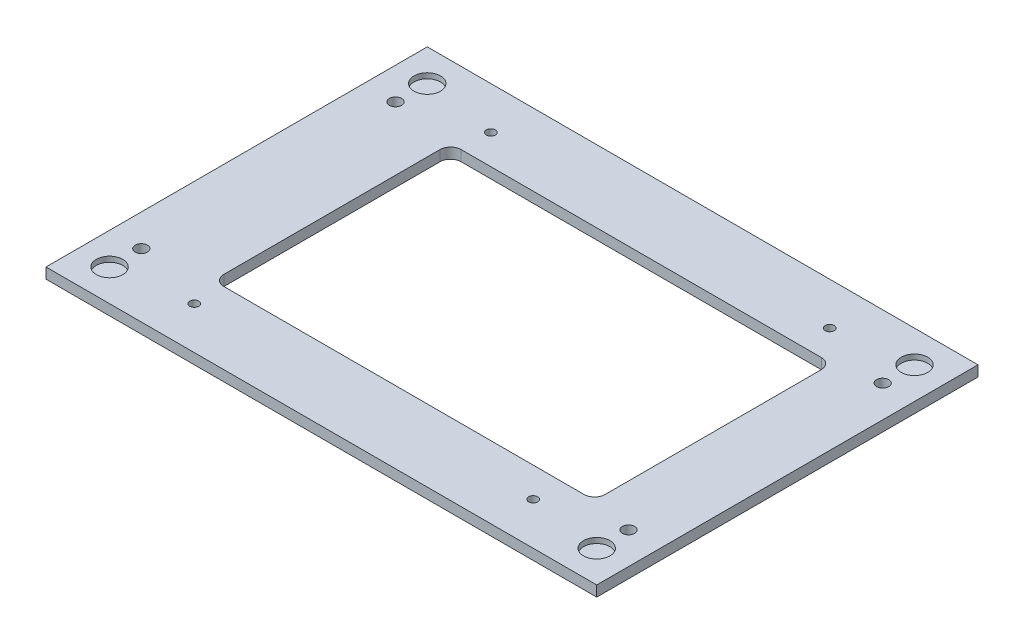
ISO-10303-21;
HEADER;
FILE_DESCRIPTION(('STEP AP214'),'2;1');
FILE_NAME('part.step','',(''),(''),'','','');
FILE_SCHEMA(('AUTOMOTIVE_DESIGN { 1 0 10303 214 1 1 1 1 }'));
ENDSEC;
DATA;
#1=APPLICATION_CONTEXT('core data for automotive mechanical design processes');
#2=APPLICATION_PROTOCOL_DEFINITION('international standard','automotive_design',2000,#1);
#3=PRODUCT_CONTEXT('',#1,'mechanical');
#4=PRODUCT('Part','Part','',(#3));
#5=PRODUCT_RELATED_PRODUCT_CATEGORY('part','',(#4));
#6=PRODUCT_DEFINITION_FORMATION('','',#4);
#7=PRODUCT_DEFINITION_CONTEXT('part definition',#1,'design');
#8=PRODUCT_DEFINITION('design','',#6,#7);
#9=PRODUCT_DEFINITION_SHAPE('','',#8);
#10=(LENGTH_UNIT() NAMED_UNIT(*) SI_UNIT(.MILLI.,.METRE.));
#11=(NAMED_UNIT(*) PLANE_ANGLE_UNIT() SI_UNIT($,.RADIAN.));
#12=(NAMED_UNIT(*) SI_UNIT($,.STERADIAN.) SOLID_ANGLE_UNIT());
#13=UNCERTAINTY_MEASURE_WITH_UNIT(LENGTH_MEASURE(1.E-05),#10,'distance_accuracy_value','');
#14=(GEOMETRIC_REPRESENTATION_CONTEXT(3) GLOBAL_UNCERTAINTY_ASSIGNED_CONTEXT((#13)) GLOBAL_UNIT_ASSIGNED_CONTEXT((#10,
#11,#12)) REPRESENTATION_CONTEXT('',''));
#15=CARTESIAN_POINT('',(0.,0.,0.));
#16=DIRECTION('',(0.,0.,1.));
#17=DIRECTION('',(1.,0.,0.));
#18=AXIS2_PLACEMENT_3D('',#15,#16,#17);
#19=CARTESIAN_POINT('',(82.55,3.175,-57.15));
#20=DIRECTION('',(0.,-1.,0.));
#21=DIRECTION('',(0.,0.,-1.));
#22=AXIS2_PLACEMENT_3D('',#19,#20,#21);
#23=PLANE('',#22);
#24=CARTESIAN_POINT('',(-73.025,3.175,-38.1));
#25=DIRECTION('',(0.,1.,0.));
#26=DIRECTION('',(0.,0.,1.));
#27=AXIS2_PLACEMENT_3D('',#24,#25,#26);
#28=CIRCLE('',#27,1.82879999999999);
#29=CARTESIAN_POINT('',(-73.025,3.175,-36.2712));
#30=VERTEX_POINT('',#29);
#31=EDGE_CURVE('E576',#30,#30,#28,.T.);
#32=ORIENTED_EDGE('',*,*,#31,.F.);
#33=EDGE_LOOP('',(#32));
#34=FACE_BOUND('',#33,.T.);
#35=CARTESIAN_POINT('',(-73.025,3.175,38.1));
#36=DIRECTION('',(0.,1.,0.));
#37=DIRECTION('',(0.,0.,1.));
#38=AXIS2_PLACEMENT_3D('',#35,#36,#37);
#39=CIRCLE('',#38,1.82879999999999);
#40=CARTESIAN_POINT('',(-73.025,3.175,39.9288));
#41=VERTEX_POINT('',#40);
#42=EDGE_CURVE('E578',#41,#41,#39,.T.);
#43=ORIENTED_EDGE('',*,*,#42,.F.);
#44=EDGE_LOOP('',(#43));
#45=FACE_BOUND('',#44,.T.);
#46=DIRECTION('',(0.,0.,-1.));
#47=VECTOR('',#46,1.);
#48=CARTESIAN_POINT('',(82.55,3.175,57.15));
#49=LINE('',#48,#47);
#50=CARTESIAN_POINT('',(82.55,3.175,57.15));
#51=VERTEX_POINT('',#50);
#52=CARTESIAN_POINT('',(82.55,3.175,-57.15));
#53=VERTEX_POINT('',#52);
#54=EDGE_CURVE('E135',#51,#53,#49,.T.);
#55=ORIENTED_EDGE('',*,*,#54,.T.);
#56=DIRECTION('',(-1.,0.,0.));
#57=VECTOR('',#56,1.);
#58=CARTESIAN_POINT('',(-82.55,3.175,-57.15));
#59=LINE('',#58,#57);
#60=CARTESIAN_POINT('',(-82.55,3.175,-57.15));
#61=VERTEX_POINT('',#60);
#62=EDGE_CURVE('E124',#53,#61,#59,.T.);
#63=ORIENTED_EDGE('',*,*,#62,.T.);
#64=DIRECTION('',(0.,0.,1.));
#65=VECTOR('',#64,1.);
#66=CARTESIAN_POINT('',(-82.55,3.175,57.15));
#67=LINE('',#66,#65);
#68=CARTESIAN_POINT('',(-82.55,3.175,57.15));
#69=VERTEX_POINT('',#68);
#70=EDGE_CURVE('E134',#61,#69,#67,.T.);
#71=ORIENTED_EDGE('',*,*,#70,.T.);
#72=DIRECTION('',(1.,0.,0.));
#73=VECTOR('',#72,1.);
#74=CARTESIAN_POINT('',(-82.55,3.175,57.15));
#75=LINE('',#74,#73);
#76=EDGE_CURVE('E140',#69,#51,#75,.T.);
#77=ORIENTED_EDGE('',*,*,#76,.T.);
#78=EDGE_LOOP('',(#55,#63,#71,#77));
#79=FACE_BOUND('',#78,.T.);
#80=CARTESIAN_POINT('',(-73.025,3.175,-47.625));
#81=DIRECTION('',(0.,1.,0.));
#82=DIRECTION('',(0.,0.,1.));
#83=AXIS2_PLACEMENT_3D('',#80,#81,#82);
#84=CIRCLE('',#83,3.96874999999999);
#85=CARTESIAN_POINT('',(-73.025,3.175,-43.65625));
#86=VERTEX_POINT('',#85);
#87=EDGE_CURVE('E258',#86,#86,#84,.T.);
#88=ORIENTED_EDGE('',*,*,#87,.F.);
#89=EDGE_LOOP('',(#88));
#90=FACE_BOUND('',#89,.T.);
#91=CARTESIAN_POINT('',(-73.025,3.175,47.625));
#92=DIRECTION('',(0.,1.,0.));
#93=DIRECTION('',(0.,0.,1.));
#94=AXIS2_PLACEMENT_3D('',#91,#92,#93);
#95=CIRCLE('',#94,3.96874999999999);
#96=CARTESIAN_POINT('',(-73.025,3.175,51.59375));
#97=VERTEX_POINT('',#96);
#98=EDGE_CURVE('E252',#97,#97,#95,.T.);
#99=ORIENTED_EDGE('',*,*,#98,.F.);
#100=EDGE_LOOP('',(#99));
#101=FACE_BOUND('',#100,.T.);
#102=CARTESIAN_POINT('',(73.025,3.175,-47.625));
#103=DIRECTION('',(0.,1.,0.));
#104=DIRECTION('',(0.,0.,1.));
#105=AXIS2_PLACEMENT_3D('',#102,#103,#104);
#106=CIRCLE('',#105,3.96874999999999);
#107=CARTESIAN_POINT('',(73.025,3.175,-43.65625));
#108=VERTEX_POINT('',#107);
#109=EDGE_CURVE('E246',#108,#108,#106,.T.);
#110=ORIENTED_EDGE('',*,*,#109,.F.);
#111=EDGE_LOOP('',(#110));
#112=FACE_BOUND('',#111,.T.);
#113=CARTESIAN_POINT('',(73.025,3.175,47.625));
#114=DIRECTION('',(0.,1.,0.));
#115=DIRECTION('',(0.,0.,1.));
#116=AXIS2_PLACEMENT_3D('',#113,#114,#115);
#117=CIRCLE('',#116,3.96874999999999);
#118=CARTESIAN_POINT('',(73.025,3.175,51.59375));
#119=VERTEX_POINT('',#118);
#120=EDGE_CURVE('E242',#119,#119,#117,.T.);
#121=ORIENTED_EDGE('',*,*,#120,.F.);
#122=EDGE_LOOP('',(#121));
#123=FACE_BOUND('',#122,.T.);
#124=CARTESIAN_POINT('',(-50.8,3.175,44.45));
#125=DIRECTION('',(0.,1.,0.));
#126=DIRECTION('',(0.,0.,1.));
#127=AXIS2_PLACEMENT_3D('',#124,#125,#126);
#128=CIRCLE('',#127,1.35255);
#129=CARTESIAN_POINT('',(-50.8,3.175,45.80255));
#130=VERTEX_POINT('',#129);
#131=EDGE_CURVE('E236',#130,#130,#128,.T.);
#132=ORIENTED_EDGE('',*,*,#131,.F.);
#133=EDGE_LOOP('',(#132));
#134=FACE_BOUND('',#133,.T.);
#135=CARTESIAN_POINT('',(50.8,3.175,44.45));
#136=DIRECTION('',(0.,1.,0.));
#137=DIRECTION('',(0.,0.,1.));
#138=AXIS2_PLACEMENT_3D('',#135,#136,#137);
#139=CIRCLE('',#138,1.35255);
#140=CARTESIAN_POINT('',(50.8,3.175,45.80255));
#141=VERTEX_POINT('',#140);
#142=EDGE_CURVE('E230',#141,#141,#139,.T.);
#143=ORIENTED_EDGE('',*,*,#142,.F.);
#144=EDGE_LOOP('',(#143));
#145=FACE_BOUND('',#144,.T.);
#146=CARTESIAN_POINT('',(50.8,3.175,-44.45));
#147=DIRECTION('',(0.,1.,0.));
#148=DIRECTION('',(0.,0.,1.));
#149=AXIS2_PLACEMENT_3D('',#146,#147,#148);
#150=CIRCLE('',#149,1.35255);
#151=CARTESIAN_POINT('',(50.8,3.175,-43.09745));
#152=VERTEX_POINT('',#151);
#153=EDGE_CURVE('E224',#152,#152,#150,.T.);
#154=ORIENTED_EDGE('',*,*,#153,.F.);
#155=EDGE_LOOP('',(#154));
#156=FACE_BOUND('',#155,.T.);
#157=CARTESIAN_POINT('',(-50.8,3.175,-44.45));
#158=DIRECTION('',(0.,1.,0.));
#159=DIRECTION('',(0.,0.,1.));
#160=AXIS2_PLACEMENT_3D('',#157,#158,#159);
#161=CIRCLE('',#160,1.35255);
#162=CARTESIAN_POINT('',(-50.8,3.175,-43.09745));
#163=VERTEX_POINT('',#162);
#164=EDGE_CURVE('E204',#163,#163,#161,.T.);
#165=ORIENTED_EDGE('',*,*,#164,.F.);
#166=EDGE_LOOP('',(#165));
#167=FACE_BOUND('',#166,.T.);
#168=DIRECTION('',(1.,0.,0.));
#169=VECTOR('',#168,1.);
#170=CARTESIAN_POINT('',(-156.330769584598,3.175,-35.56));
#171=LINE('',#170,#169);
#172=CARTESIAN_POINT('',(-50.8,3.175,-35.56));
#173=VERTEX_POINT('',#172);
#174=CARTESIAN_POINT('',(57.15,3.175,-35.56));
#175=VERTEX_POINT('',#174);
#176=EDGE_CURVE('E190',#173,#175,#171,.T.);
#177=ORIENTED_EDGE('',*,*,#176,.T.);
#178=CARTESIAN_POINT('',(57.15,3.175,-32.385));
#179=DIRECTION('',(0.,-1.,0.));
#180=DIRECTION('',(0.,0.,-1.));
#181=AXIS2_PLACEMENT_3D('',#178,#179,#180);
#182=CIRCLE('',#181,3.175);
#183=CARTESIAN_POINT('',(60.325,3.175,-32.385));
#184=VERTEX_POINT('',#183);
#185=EDGE_CURVE('E177',#175,#184,#182,.T.);
#186=ORIENTED_EDGE('',*,*,#185,.T.);
#187=DIRECTION('',(0.,0.,1.));
#188=VECTOR('',#187,1.);
#189=CARTESIAN_POINT('',(60.325,3.175,0.));
#190=LINE('',#189,#188);
#191=CARTESIAN_POINT('',(60.325,3.175,32.385));
#192=VERTEX_POINT('',#191);
#193=EDGE_CURVE('E199',#184,#192,#190,.T.);
#194=ORIENTED_EDGE('',*,*,#193,.T.);
#195=CARTESIAN_POINT('',(57.15,3.175,32.385));
#196=DIRECTION('',(0.,-1.,0.));
#197=DIRECTION('',(0.,0.,-1.));
#198=AXIS2_PLACEMENT_3D('',#195,#196,#197);
#199=CIRCLE('',#198,3.175);
#200=CARTESIAN_POINT('',(57.15,3.175,35.56));
#201=VERTEX_POINT('',#200);
#202=EDGE_CURVE('E173',#192,#201,#199,.T.);
#203=ORIENTED_EDGE('',*,*,#202,.T.);
#204=DIRECTION('',(1.,0.,0.));
#205=VECTOR('',#204,1.);
#206=CARTESIAN_POINT('',(-156.330769584598,3.175,35.56));
#207=LINE('',#206,#205);
#208=CARTESIAN_POINT('',(-50.8,3.175,35.56));
#209=VERTEX_POINT('',#208);
#210=EDGE_CURVE('E214',#209,#201,#207,.T.);
#211=ORIENTED_EDGE('',*,*,#210,.F.);
#212=CARTESIAN_POINT('',(-50.8,3.175,32.385));
#213=DIRECTION('',(0.,-1.,0.));
#214=DIRECTION('',(0.,0.,-1.));
#215=AXIS2_PLACEMENT_3D('',#212,#213,#214);
#216=CIRCLE('',#215,3.175);
#217=CARTESIAN_POINT('',(-53.975,3.175,32.385));
#218=VERTEX_POINT('',#217);
#219=EDGE_CURVE('E181',#209,#218,#216,.T.);
#220=ORIENTED_EDGE('',*,*,#219,.T.);
#221=DIRECTION('',(0.,0.,-1.));
#222=VECTOR('',#221,1.);
#223=CARTESIAN_POINT('',(-53.975,3.175,0.));
#224=LINE('',#223,#222);
#225=CARTESIAN_POINT('',(-53.975,3.175,-32.385));
#226=VERTEX_POINT('',#225);
#227=EDGE_CURVE('E191',#218,#226,#224,.T.);
#228=ORIENTED_EDGE('',*,*,#227,.T.);
#229=CARTESIAN_POINT('',(-50.8,3.175,-32.385));
#230=DIRECTION('',(0.,-1.,0.));
#231=DIRECTION('',(0.,0.,-1.));
#232=AXIS2_PLACEMENT_3D('',#229,#230,#231);
#233=CIRCLE('',#232,3.175);
#234=EDGE_CURVE('E43',#226,#173,#233,.T.);
#235=ORIENTED_EDGE('',*,*,#234,.T.);
#236=EDGE_LOOP('',(#177,#186,#194,#203,#211,#220,#228,#235));
#237=FACE_BOUND('',#236,.T.);
#238=CARTESIAN_POINT('',(73.025,3.175,38.1));
#239=DIRECTION('',(0.,1.,0.));
#240=DIRECTION('',(0.,0.,1.));
#241=AXIS2_PLACEMENT_3D('',#238,#239,#240);
#242=CIRCLE('',#241,1.82879999999999);
#243=CARTESIAN_POINT('',(73.025,3.175,39.9288));
#244=VERTEX_POINT('',#243);
#245=EDGE_CURVE('E587',#244,#244,#242,.T.);
#246=ORIENTED_EDGE('',*,*,#245,.F.);
#247=EDGE_LOOP('',(#246));
#248=FACE_BOUND('',#247,.T.);
#249=CARTESIAN_POINT('',(73.025,3.175,-38.1));
#250=DIRECTION('',(0.,1.,0.));
#251=DIRECTION('',(0.,0.,1.));
#252=AXIS2_PLACEMENT_3D('',#249,#250,#251);
#253=CIRCLE('',#252,1.82879999999999);
#254=CARTESIAN_POINT('',(73.025,3.175,-36.2712));
#255=VERTEX_POINT('',#254);
#256=EDGE_CURVE('E584',#255,#255,#253,.T.);
#257=ORIENTED_EDGE('',*,*,#256,.F.);
#258=EDGE_LOOP('',(#257));
#259=FACE_BOUND('',#258,.T.);
#260=ADVANCED_FACE('F34',(#34,#45,#79,#90,#101,#112,#123,#134,#145,#156,#167,#237,#248,#259),
#23,.F.);
#261=CARTESIAN_POINT('',(82.55,3.175,57.15));
#262=DIRECTION('',(-1.,0.,0.));
#263=DIRECTION('',(0.,0.,1.));
#264=AXIS2_PLACEMENT_3D('',#261,#262,#263);
#265=PLANE('',#264);
#266=DIRECTION('',(0.,0.,-1.));
#267=VECTOR('',#266,1.);
#268=CARTESIAN_POINT('',(82.55,0.,57.15));
#269=LINE('',#268,#267);
#270=CARTESIAN_POINT('',(82.55,0.,57.15));
#271=VERTEX_POINT('',#270);
#272=CARTESIAN_POINT('',(82.55,0.,-57.15));
#273=VERTEX_POINT('',#272);
#274=EDGE_CURVE('E148',#271,#273,#269,.T.);
#275=ORIENTED_EDGE('',*,*,#274,.T.);
#276=DIRECTION('',(0.,-1.,0.));
#277=VECTOR('',#276,1.);
#278=CARTESIAN_POINT('',(82.55,3.175,-57.15));
#279=LINE('',#278,#277);
#280=EDGE_CURVE('E128',#53,#273,#279,.T.);
#281=ORIENTED_EDGE('',*,*,#280,.F.);
#282=ORIENTED_EDGE('',*,*,#54,.F.);
#283=DIRECTION('',(0.,-1.,0.));
#284=VECTOR('',#283,1.);
#285=CARTESIAN_POINT('',(82.55,3.175,57.15));
#286=LINE('',#285,#284);
#287=EDGE_CURVE('E268',#51,#271,#286,.T.);
#288=ORIENTED_EDGE('',*,*,#287,.T.);
#289=EDGE_LOOP('',(#275,#281,#282,#288));
#290=FACE_BOUND('',#289,.T.);
#291=ADVANCED_FACE('F146',(#290),#265,.F.);
#292=CARTESIAN_POINT('',(-82.55,3.175,-57.15));
#293=DIRECTION('',(0.,0.,1.));
#294=DIRECTION('',(1.,0.,0.));
#295=AXIS2_PLACEMENT_3D('',#292,#293,#294);
#296=PLANE('',#295);
#297=DIRECTION('',(-1.,0.,0.));
#298=VECTOR('',#297,1.);
#299=CARTESIAN_POINT('',(-82.55,0.,-57.15));
#300=LINE('',#299,#298);
#301=CARTESIAN_POINT('',(-82.55,0.,-57.15));
#302=VERTEX_POINT('',#301);
#303=EDGE_CURVE('E270',#273,#302,#300,.T.);
#304=ORIENTED_EDGE('',*,*,#303,.T.);
#305=DIRECTION('',(0.,-1.,0.));
#306=VECTOR('',#305,1.);
#307=CARTESIAN_POINT('',(-82.55,3.175,-57.15));
#308=LINE('',#307,#306);
#309=EDGE_CURVE('E131',#61,#302,#308,.T.);
#310=ORIENTED_EDGE('',*,*,#309,.F.);
#311=ORIENTED_EDGE('',*,*,#62,.F.);
#312=ORIENTED_EDGE('',*,*,#280,.T.);
#313=EDGE_LOOP('',(#304,#310,#311,#312));
#314=FACE_BOUND('',#313,.T.);
#315=ADVANCED_FACE('F126',(#314),#296,.F.);
#316=CARTESIAN_POINT('',(-82.55,3.175,57.15));
#317=DIRECTION('',(1.,0.,0.));
#318=DIRECTION('',(0.,0.,-1.));
#319=AXIS2_PLACEMENT_3D('',#316,#317,#318);
#320=PLANE('',#319);
#321=DIRECTION('',(0.,0.,1.));
#322=VECTOR('',#321,1.);
#323=CARTESIAN_POINT('',(-82.55,0.,57.15));
#324=LINE('',#323,#322);
#325=CARTESIAN_POINT('',(-82.55,0.,57.15));
#326=VERTEX_POINT('',#325);
#327=EDGE_CURVE('E272',#302,#326,#324,.T.);
#328=ORIENTED_EDGE('',*,*,#327,.T.);
#329=DIRECTION('',(0.,-1.,0.));
#330=VECTOR('',#329,1.);
#331=CARTESIAN_POINT('',(-82.55,3.175,57.15));
#332=LINE('',#331,#330);
#333=EDGE_CURVE('E153',#69,#326,#332,.T.);
#334=ORIENTED_EDGE('',*,*,#333,.F.);
#335=ORIENTED_EDGE('',*,*,#70,.F.);
#336=ORIENTED_EDGE('',*,*,#309,.T.);
#337=EDGE_LOOP('',(#328,#334,#335,#336));
#338=FACE_BOUND('',#337,.T.);
#339=ADVANCED_FACE('F284',(#338),#320,.F.);
#340=CARTESIAN_POINT('',(-82.55,3.175,57.15));
#341=DIRECTION('',(0.,0.,-1.));
#342=DIRECTION('',(-1.,0.,0.));
#343=AXIS2_PLACEMENT_3D('',#340,#341,#342);
#344=PLANE('',#343);
#345=DIRECTION('',(1.,0.,0.));
#346=VECTOR('',#345,1.);
#347=CARTESIAN_POINT('',(-82.55,0.,57.15));
#348=LINE('',#347,#346);
#349=EDGE_CURVE('E144',#326,#271,#348,.T.);
#350=ORIENTED_EDGE('',*,*,#349,.T.);
#351=ORIENTED_EDGE('',*,*,#287,.F.);
#352=ORIENTED_EDGE('',*,*,#76,.F.);
#353=ORIENTED_EDGE('',*,*,#333,.T.);
#354=EDGE_LOOP('',(#350,#351,#352,#353));
#355=FACE_BOUND('',#354,.T.);
#356=ADVANCED_FACE('F279',(#355),#344,.F.);
#357=CARTESIAN_POINT('',(82.55,0.,-57.15));
#358=DIRECTION('',(0.,-1.,0.));
#359=DIRECTION('',(0.,0.,-1.));
#360=AXIS2_PLACEMENT_3D('',#357,#358,#359);
#361=PLANE('',#360);
#362=CARTESIAN_POINT('',(-73.025,0.,-38.1));
#363=DIRECTION('',(0.,-1.,0.));
#364=DIRECTION('',(0.,0.,-1.));
#365=AXIS2_PLACEMENT_3D('',#362,#363,#364);
#366=CIRCLE('',#365,1.82879999999999);
#367=CARTESIAN_POINT('',(-73.025,0.,-39.9288));
#368=VERTEX_POINT('',#367);
#369=EDGE_CURVE('E316',#368,#368,#366,.T.);
#370=ORIENTED_EDGE('',*,*,#369,.F.);
#371=EDGE_LOOP('',(#370));
#372=FACE_BOUND('',#371,.T.);
#373=CARTESIAN_POINT('',(-73.025,0.,38.1));
#374=DIRECTION('',(0.,-1.,0.));
#375=DIRECTION('',(0.,0.,-1.));
#376=AXIS2_PLACEMENT_3D('',#373,#374,#375);
#377=CIRCLE('',#376,1.82879999999999);
#378=CARTESIAN_POINT('',(-73.025,0.,36.2712));
#379=VERTEX_POINT('',#378);
#380=EDGE_CURVE('E320',#379,#379,#377,.T.);
#381=ORIENTED_EDGE('',*,*,#380,.F.);
#382=EDGE_LOOP('',(#381));
#383=FACE_BOUND('',#382,.T.);
#384=CARTESIAN_POINT('',(73.025,0.,-38.1));
#385=DIRECTION('',(0.,-1.,0.));
#386=DIRECTION('',(0.,0.,-1.));
#387=AXIS2_PLACEMENT_3D('',#384,#385,#386);
#388=CIRCLE('',#387,1.82879999999999);
#389=CARTESIAN_POINT('',(73.025,0.,-39.9288));
#390=VERTEX_POINT('',#389);
#391=EDGE_CURVE('E38',#390,#390,#388,.T.);
#392=ORIENTED_EDGE('',*,*,#391,.F.);
#393=EDGE_LOOP('',(#392));
#394=FACE_BOUND('',#393,.T.);
#395=CARTESIAN_POINT('',(73.025,0.,38.1));
#396=DIRECTION('',(0.,-1.,0.));
#397=DIRECTION('',(0.,0.,-1.));
#398=AXIS2_PLACEMENT_3D('',#395,#396,#397);
#399=CIRCLE('',#398,1.82879999999999);
#400=CARTESIAN_POINT('',(73.025,0.,36.2712));
#401=VERTEX_POINT('',#400);
#402=EDGE_CURVE('E217',#401,#401,#399,.T.);
#403=ORIENTED_EDGE('',*,*,#402,.F.);
#404=EDGE_LOOP('',(#403));
#405=FACE_BOUND('',#404,.T.);
#406=DIRECTION('',(0.,0.,-1.));
#407=VECTOR('',#406,1.);
#408=CARTESIAN_POINT('',(-53.975,0.,0.));
#409=LINE('',#408,#407);
#410=CARTESIAN_POINT('',(-53.975,0.,32.385));
#411=VERTEX_POINT('',#410);
#412=CARTESIAN_POINT('',(-53.975,0.,-32.385));
#413=VERTEX_POINT('',#412);
#414=EDGE_CURVE('E202',#411,#413,#409,.T.);
#415=ORIENTED_EDGE('',*,*,#414,.F.);
#416=CARTESIAN_POINT('',(-50.8,0.,32.385));
#417=DIRECTION('',(0.,-1.,0.));
#418=DIRECTION('',(0.,0.,-1.));
#419=AXIS2_PLACEMENT_3D('',#416,#417,#418);
#420=CIRCLE('',#419,3.175);
#421=CARTESIAN_POINT('',(-50.8,0.,35.56));
#422=VERTEX_POINT('',#421);
#423=EDGE_CURVE('E183',#411,#422,#420,.F.);
#424=ORIENTED_EDGE('',*,*,#423,.T.);
#425=DIRECTION('',(1.,0.,0.));
#426=VECTOR('',#425,1.);
#427=CARTESIAN_POINT('',(-156.330769584598,0.,35.56));
#428=LINE('',#427,#426);
#429=CARTESIAN_POINT('',(57.15,0.,35.56));
#430=VERTEX_POINT('',#429);
#431=EDGE_CURVE('E220',#422,#430,#428,.T.);
#432=ORIENTED_EDGE('',*,*,#431,.T.);
#433=CARTESIAN_POINT('',(57.15,0.,32.385));
#434=DIRECTION('',(0.,-1.,0.));
#435=DIRECTION('',(0.,0.,-1.));
#436=AXIS2_PLACEMENT_3D('',#433,#434,#435);
#437=CIRCLE('',#436,3.175);
#438=CARTESIAN_POINT('',(60.325,0.,32.385));
#439=VERTEX_POINT('',#438);
#440=EDGE_CURVE('E175',#430,#439,#437,.F.);
#441=ORIENTED_EDGE('',*,*,#440,.T.);
#442=DIRECTION('',(0.,0.,1.));
#443=VECTOR('',#442,1.);
#444=CARTESIAN_POINT('',(60.325,0.,0.));
#445=LINE('',#444,#443);
#446=CARTESIAN_POINT('',(60.325,0.,-32.385));
#447=VERTEX_POINT('',#446);
#448=EDGE_CURVE('E210',#447,#439,#445,.T.);
#449=ORIENTED_EDGE('',*,*,#448,.F.);
#450=CARTESIAN_POINT('',(57.15,0.,-32.385));
#451=DIRECTION('',(0.,-1.,0.));
#452=DIRECTION('',(0.,0.,-1.));
#453=AXIS2_PLACEMENT_3D('',#450,#451,#452);
#454=CIRCLE('',#453,3.175);
#455=CARTESIAN_POINT('',(57.15,0.,-35.56));
#456=VERTEX_POINT('',#455);
#457=EDGE_CURVE('E179',#447,#456,#454,.F.);
#458=ORIENTED_EDGE('',*,*,#457,.T.);
#459=DIRECTION('',(1.,0.,0.));
#460=VECTOR('',#459,1.);
#461=CARTESIAN_POINT('',(-156.330769584598,0.,-35.56));
#462=LINE('',#461,#460);
#463=CARTESIAN_POINT('',(-50.8,0.,-35.56));
#464=VERTEX_POINT('',#463);
#465=EDGE_CURVE('E205',#464,#456,#462,.T.);
#466=ORIENTED_EDGE('',*,*,#465,.F.);
#467=CARTESIAN_POINT('',(-50.8,0.,-32.385));
#468=DIRECTION('',(0.,-1.,0.));
#469=DIRECTION('',(0.,0.,-1.));
#470=AXIS2_PLACEMENT_3D('',#467,#468,#469);
#471=CIRCLE('',#470,3.175);
#472=EDGE_CURVE('E11',#464,#413,#471,.F.);
#473=ORIENTED_EDGE('',*,*,#472,.T.);
#474=EDGE_LOOP('',(#415,#424,#432,#441,#449,#458,#466,#473));
#475=FACE_BOUND('',#474,.T.);
#476=CARTESIAN_POINT('',(-50.8,0.,-44.45));
#477=DIRECTION('',(0.,1.,0.));
#478=DIRECTION('',(0.,0.,1.));
#479=AXIS2_PLACEMENT_3D('',#476,#477,#478);
#480=CIRCLE('',#479,1.35255);
#481=CARTESIAN_POINT('',(-50.8,0.,-43.09745));
#482=VERTEX_POINT('',#481);
#483=EDGE_CURVE('E208',#482,#482,#480,.T.);
#484=ORIENTED_EDGE('',*,*,#483,.T.);
#485=EDGE_LOOP('',(#484));
#486=FACE_BOUND('',#485,.T.);
#487=CARTESIAN_POINT('',(50.8,0.,-44.45));
#488=DIRECTION('',(0.,1.,0.));
#489=DIRECTION('',(0.,0.,1.));
#490=AXIS2_PLACEMENT_3D('',#487,#488,#489);
#491=CIRCLE('',#490,1.35255);
#492=CARTESIAN_POINT('',(50.8,0.,-43.09745));
#493=VERTEX_POINT('',#492);
#494=EDGE_CURVE('E227',#493,#493,#491,.T.);
#495=ORIENTED_EDGE('',*,*,#494,.T.);
#496=EDGE_LOOP('',(#495));
#497=FACE_BOUND('',#496,.T.);
#498=CARTESIAN_POINT('',(50.8,0.,44.45));
#499=DIRECTION('',(0.,1.,0.));
#500=DIRECTION('',(0.,0.,1.));
#501=AXIS2_PLACEMENT_3D('',#498,#499,#500);
#502=CIRCLE('',#501,1.35255);
#503=CARTESIAN_POINT('',(50.8,0.,45.80255));
#504=VERTEX_POINT('',#503);
#505=EDGE_CURVE('E233',#504,#504,#502,.T.);
#506=ORIENTED_EDGE('',*,*,#505,.T.);
#507=EDGE_LOOP('',(#506));
#508=FACE_BOUND('',#507,.T.);
#509=CARTESIAN_POINT('',(-50.8,0.,44.45));
#510=DIRECTION('',(0.,1.,0.));
#511=DIRECTION('',(0.,0.,1.));
#512=AXIS2_PLACEMENT_3D('',#509,#510,#511);
#513=CIRCLE('',#512,1.35255);
#514=CARTESIAN_POINT('',(-50.8,0.,45.80255));
#515=VERTEX_POINT('',#514);
#516=EDGE_CURVE('E239',#515,#515,#513,.T.);
#517=ORIENTED_EDGE('',*,*,#516,.T.);
#518=EDGE_LOOP('',(#517));
#519=FACE_BOUND('',#518,.T.);
#520=ORIENTED_EDGE('',*,*,#274,.F.);
#521=ORIENTED_EDGE('',*,*,#349,.F.);
#522=ORIENTED_EDGE('',*,*,#327,.F.);
#523=ORIENTED_EDGE('',*,*,#303,.F.);
#524=EDGE_LOOP('',(#520,#521,#522,#523));
#525=FACE_BOUND('',#524,.T.);
#526=ADVANCED_FACE('F283',(#372,#383,#394,#405,#475,#486,#497,#508,#519,#525),#361,.T.);
#527=CARTESIAN_POINT('',(-73.025,1.5875,-47.625));
#528=DIRECTION('',(0.,1.,0.));
#529=DIRECTION('',(0.,0.,1.));
#530=AXIS2_PLACEMENT_3D('',#527,#528,#529);
#531=CYLINDRICAL_SURFACE('',#530,3.96874999999999);
#532=CARTESIAN_POINT('',(-73.025,1.5875,-47.625));
#533=DIRECTION('',(0.,1.,0.));
#534=DIRECTION('',(0.,0.,1.));
#535=AXIS2_PLACEMENT_3D('',#532,#533,#534);
#536=CIRCLE('',#535,3.96874999999999);
#537=CARTESIAN_POINT('',(-73.025,1.5875,-43.65625));
#538=VERTEX_POINT('',#537);
#539=EDGE_CURVE('E261',#538,#538,#536,.T.);
#540=ORIENTED_EDGE('',*,*,#539,.F.);
#541=EDGE_LOOP('',(#540));
#542=FACE_BOUND('',#541,.T.);
#543=ORIENTED_EDGE('',*,*,#87,.T.);
#544=EDGE_LOOP('',(#543));
#545=FACE_BOUND('',#544,.T.);
#546=ADVANCED_FACE('F304',(#542,#545),#531,.F.);
#547=CARTESIAN_POINT('',(-73.025,1.5875,-47.625));
#548=DIRECTION('',(0.,1.,0.));
#549=DIRECTION('',(0.,0.,1.));
#550=AXIS2_PLACEMENT_3D('',#547,#548,#549);
#551=PLANE('',#550);
#552=ORIENTED_EDGE('',*,*,#539,.T.);
#553=EDGE_LOOP('',(#552));
#554=FACE_BOUND('',#553,.T.);
#555=ADVANCED_FACE('F311',(#554),#551,.T.);
#556=CARTESIAN_POINT('',(-73.025,1.5875,47.625));
#557=DIRECTION('',(0.,1.,0.));
#558=DIRECTION('',(0.,0.,1.));
#559=AXIS2_PLACEMENT_3D('',#556,#557,#558);
#560=CYLINDRICAL_SURFACE('',#559,3.96874999999999);
#561=CARTESIAN_POINT('',(-73.025,1.5875,47.625));
#562=DIRECTION('',(0.,1.,0.));
#563=DIRECTION('',(0.,0.,1.));
#564=AXIS2_PLACEMENT_3D('',#561,#562,#563);
#565=CIRCLE('',#564,3.96874999999999);
#566=CARTESIAN_POINT('',(-73.025,1.5875,51.59375));
#567=VERTEX_POINT('',#566);
#568=EDGE_CURVE('E255',#567,#567,#565,.T.);
#569=ORIENTED_EDGE('',*,*,#568,.F.);
#570=EDGE_LOOP('',(#569));
#571=FACE_BOUND('',#570,.T.);
#572=ORIENTED_EDGE('',*,*,#98,.T.);
#573=EDGE_LOOP('',(#572));
#574=FACE_BOUND('',#573,.T.);
#575=ADVANCED_FACE('F387',(#571,#574),#560,.F.);
#576=CARTESIAN_POINT('',(-73.025,1.5875,47.625));
#577=DIRECTION('',(0.,1.,0.));
#578=DIRECTION('',(0.,0.,1.));
#579=AXIS2_PLACEMENT_3D('',#576,#577,#578);
#580=PLANE('',#579);
#581=ORIENTED_EDGE('',*,*,#568,.T.);
#582=EDGE_LOOP('',(#581));
#583=FACE_BOUND('',#582,.T.);
#584=ADVANCED_FACE('F383',(#583),#580,.T.);
#585=CARTESIAN_POINT('',(73.025,1.5875,-47.625));
#586=DIRECTION('',(0.,1.,0.));
#587=DIRECTION('',(0.,0.,1.));
#588=AXIS2_PLACEMENT_3D('',#585,#586,#587);
#589=CYLINDRICAL_SURFACE('',#588,3.96874999999999);
#590=CARTESIAN_POINT('',(73.025,1.5875,-47.625));
#591=DIRECTION('',(0.,1.,0.));
#592=DIRECTION('',(0.,0.,1.));
#593=AXIS2_PLACEMENT_3D('',#590,#591,#592);
#594=CIRCLE('',#593,3.96874999999999);
#595=CARTESIAN_POINT('',(73.025,1.5875,-43.65625));
#596=VERTEX_POINT('',#595);
#597=EDGE_CURVE('E249',#596,#596,#594,.T.);
#598=ORIENTED_EDGE('',*,*,#597,.F.);
#599=EDGE_LOOP('',(#598));
#600=FACE_BOUND('',#599,.T.);
#601=ORIENTED_EDGE('',*,*,#109,.T.);
#602=EDGE_LOOP('',(#601));
#603=FACE_BOUND('',#602,.T.);
#604=ADVANCED_FACE('F379',(#600,#603),#589,.F.);
#605=CARTESIAN_POINT('',(73.025,1.5875,-47.625));
#606=DIRECTION('',(0.,1.,0.));
#607=DIRECTION('',(0.,0.,1.));
#608=AXIS2_PLACEMENT_3D('',#605,#606,#607);
#609=PLANE('',#608);
#610=ORIENTED_EDGE('',*,*,#597,.T.);
#611=EDGE_LOOP('',(#610));
#612=FACE_BOUND('',#611,.T.);
#613=ADVANCED_FACE('F375',(#612),#609,.T.);
#614=CARTESIAN_POINT('',(73.025,1.5875,47.625));
#615=DIRECTION('',(0.,1.,0.));
#616=DIRECTION('',(0.,0.,1.));
#617=AXIS2_PLACEMENT_3D('',#614,#615,#616);
#618=CYLINDRICAL_SURFACE('',#617,3.96874999999999);
#619=CARTESIAN_POINT('',(73.025,1.5875,47.625));
#620=DIRECTION('',(0.,1.,0.));
#621=DIRECTION('',(0.,0.,1.));
#622=AXIS2_PLACEMENT_3D('',#619,#620,#621);
#623=CIRCLE('',#622,3.96874999999999);
#624=CARTESIAN_POINT('',(73.025,1.5875,51.59375));
#625=VERTEX_POINT('',#624);
#626=EDGE_CURVE('E243',#625,#625,#623,.T.);
#627=ORIENTED_EDGE('',*,*,#626,.F.);
#628=EDGE_LOOP('',(#627));
#629=FACE_BOUND('',#628,.T.);
#630=ORIENTED_EDGE('',*,*,#120,.T.);
#631=EDGE_LOOP('',(#630));
#632=FACE_BOUND('',#631,.T.);
#633=ADVANCED_FACE('F371',(#629,#632),#618,.F.);
#634=CARTESIAN_POINT('',(73.025,1.5875,47.625));
#635=DIRECTION('',(0.,1.,0.));
#636=DIRECTION('',(0.,0.,1.));
#637=AXIS2_PLACEMENT_3D('',#634,#635,#636);
#638=PLANE('',#637);
#639=ORIENTED_EDGE('',*,*,#626,.T.);
#640=EDGE_LOOP('',(#639));
#641=FACE_BOUND('',#640,.T.);
#642=ADVANCED_FACE('F339',(#641),#638,.T.);
#643=CARTESIAN_POINT('',(-50.8,3.175,44.45));
#644=DIRECTION('',(0.,1.,0.));
#645=DIRECTION('',(0.,0.,1.));
#646=AXIS2_PLACEMENT_3D('',#643,#644,#645);
#647=CYLINDRICAL_SURFACE('',#646,1.35255);
#648=ORIENTED_EDGE('',*,*,#516,.F.);
#649=EDGE_LOOP('',(#648));
#650=FACE_BOUND('',#649,.T.);
#651=ORIENTED_EDGE('',*,*,#131,.T.);
#652=EDGE_LOOP('',(#651));
#653=FACE_BOUND('',#652,.T.);
#654=ADVANCED_FACE('F335',(#650,#653),#647,.F.);
#655=CARTESIAN_POINT('',(50.8,3.175,44.45));
#656=DIRECTION('',(0.,1.,0.));
#657=DIRECTION('',(0.,0.,1.));
#658=AXIS2_PLACEMENT_3D('',#655,#656,#657);
#659=CYLINDRICAL_SURFACE('',#658,1.35255);
#660=ORIENTED_EDGE('',*,*,#505,.F.);
#661=EDGE_LOOP('',(#660));
#662=FACE_BOUND('',#661,.T.);
#663=ORIENTED_EDGE('',*,*,#142,.T.);
#664=EDGE_LOOP('',(#663));
#665=FACE_BOUND('',#664,.T.);
#666=ADVANCED_FACE('F338',(#662,#665),#659,.F.);
#667=CARTESIAN_POINT('',(50.8,3.175,-44.45));
#668=DIRECTION('',(0.,1.,0.));
#669=DIRECTION('',(0.,0.,1.));
#670=AXIS2_PLACEMENT_3D('',#667,#668,#669);
#671=CYLINDRICAL_SURFACE('',#670,1.35255);
#672=ORIENTED_EDGE('',*,*,#494,.F.);
#673=EDGE_LOOP('',(#672));
#674=FACE_BOUND('',#673,.T.);
#675=ORIENTED_EDGE('',*,*,#153,.T.);
#676=EDGE_LOOP('',(#675));
#677=FACE_BOUND('',#676,.T.);
#678=ADVANCED_FACE('F353',(#674,#677),#671,.F.);
#679=CARTESIAN_POINT('',(-50.8,3.175,-44.45));
#680=DIRECTION('',(0.,1.,0.));
#681=DIRECTION('',(0.,0.,1.));
#682=AXIS2_PLACEMENT_3D('',#679,#680,#681);
#683=CYLINDRICAL_SURFACE('',#682,1.35255);
#684=ORIENTED_EDGE('',*,*,#483,.F.);
#685=EDGE_LOOP('',(#684));
#686=FACE_BOUND('',#685,.T.);
#687=ORIENTED_EDGE('',*,*,#164,.T.);
#688=EDGE_LOOP('',(#687));
#689=FACE_BOUND('',#688,.T.);
#690=ADVANCED_FACE('F350',(#686,#689),#683,.F.);
#691=CARTESIAN_POINT('',(-156.330769584598,0.,35.56));
#692=DIRECTION('',(0.,0.,1.));
#693=DIRECTION('',(1.,0.,0.));
#694=AXIS2_PLACEMENT_3D('',#691,#692,#693);
#695=PLANE('',#694);
#696=ORIENTED_EDGE('',*,*,#210,.T.);
#697=DIRECTION('',(0.,1.,0.));
#698=VECTOR('',#697,1.);
#699=CARTESIAN_POINT('',(57.15,0.,35.56));
#700=LINE('',#699,#698);
#701=EDGE_CURVE('E162',#201,#430,#700,.F.);
#702=ORIENTED_EDGE('',*,*,#701,.T.);
#703=ORIENTED_EDGE('',*,*,#431,.F.);
#704=DIRECTION('',(0.,1.,0.));
#705=VECTOR('',#704,1.);
#706=CARTESIAN_POINT('',(-50.8,0.,35.56));
#707=LINE('',#706,#705);
#708=EDGE_CURVE('E159',#422,#209,#707,.T.);
#709=ORIENTED_EDGE('',*,*,#708,.T.);
#710=EDGE_LOOP('',(#696,#702,#703,#709));
#711=FACE_BOUND('',#710,.T.);
#712=ADVANCED_FACE('F352',(#711),#695,.F.);
#713=CARTESIAN_POINT('',(-53.975,0.,0.));
#714=DIRECTION('',(1.,0.,0.));
#715=DIRECTION('',(0.,0.,-1.));
#716=AXIS2_PLACEMENT_3D('',#713,#714,#715);
#717=PLANE('',#716);
#718=ORIENTED_EDGE('',*,*,#227,.F.);
#719=DIRECTION('',(0.,1.,0.));
#720=VECTOR('',#719,1.);
#721=CARTESIAN_POINT('',(-53.975,0.,32.385));
#722=LINE('',#721,#720);
#723=EDGE_CURVE('E55',#218,#411,#722,.F.);
#724=ORIENTED_EDGE('',*,*,#723,.T.);
#725=ORIENTED_EDGE('',*,*,#414,.T.);
#726=DIRECTION('',(0.,1.,0.));
#727=VECTOR('',#726,1.);
#728=CARTESIAN_POINT('',(-53.975,3.175,-32.385));
#729=LINE('',#728,#727);
#730=EDGE_CURVE('E169',#413,#226,#729,.T.);
#731=ORIENTED_EDGE('',*,*,#730,.T.);
#732=EDGE_LOOP('',(#718,#724,#725,#731));
#733=FACE_BOUND('',#732,.T.);
#734=ADVANCED_FACE('F201',(#733),#717,.T.);
#735=CARTESIAN_POINT('',(-156.330769584598,0.,-35.56));
#736=DIRECTION('',(0.,0.,1.));
#737=DIRECTION('',(1.,0.,0.));
#738=AXIS2_PLACEMENT_3D('',#735,#736,#737);
#739=PLANE('',#738);
#740=ORIENTED_EDGE('',*,*,#465,.T.);
#741=DIRECTION('',(0.,1.,0.));
#742=VECTOR('',#741,1.);
#743=CARTESIAN_POINT('',(57.15,3.175,-35.56));
#744=LINE('',#743,#742);
#745=EDGE_CURVE('E166',#456,#175,#744,.T.);
#746=ORIENTED_EDGE('',*,*,#745,.T.);
#747=ORIENTED_EDGE('',*,*,#176,.F.);
#748=DIRECTION('',(0.,1.,0.));
#749=VECTOR('',#748,1.);
#750=CARTESIAN_POINT('',(-50.8,0.,-35.56));
#751=LINE('',#750,#749);
#752=EDGE_CURVE('E164',#173,#464,#751,.F.);
#753=ORIENTED_EDGE('',*,*,#752,.T.);
#754=EDGE_LOOP('',(#740,#746,#747,#753));
#755=FACE_BOUND('',#754,.T.);
#756=ADVANCED_FACE('F197',(#755),#739,.T.);
#757=CARTESIAN_POINT('',(60.325,0.,0.));
#758=DIRECTION('',(-1.,0.,0.));
#759=DIRECTION('',(0.,0.,1.));
#760=AXIS2_PLACEMENT_3D('',#757,#758,#759);
#761=PLANE('',#760);
#762=ORIENTED_EDGE('',*,*,#448,.T.);
#763=DIRECTION('',(0.,1.,0.));
#764=VECTOR('',#763,1.);
#765=CARTESIAN_POINT('',(60.325,0.,32.385));
#766=LINE('',#765,#764);
#767=EDGE_CURVE('E151',#439,#192,#766,.T.);
#768=ORIENTED_EDGE('',*,*,#767,.T.);
#769=ORIENTED_EDGE('',*,*,#193,.F.);
#770=DIRECTION('',(0.,1.,0.));
#771=VECTOR('',#770,1.);
#772=CARTESIAN_POINT('',(60.325,0.,-32.385));
#773=LINE('',#772,#771);
#774=EDGE_CURVE('E149',#184,#447,#773,.F.);
#775=ORIENTED_EDGE('',*,*,#774,.T.);
#776=EDGE_LOOP('',(#762,#768,#769,#775));
#777=FACE_BOUND('',#776,.T.);
#778=ADVANCED_FACE('F476',(#777),#761,.T.);
#779=CARTESIAN_POINT('',(57.15,0.,32.385));
#780=DIRECTION('',(0.,1.,0.));
#781=DIRECTION('',(0.,0.,1.));
#782=AXIS2_PLACEMENT_3D('',#779,#780,#781);
#783=CYLINDRICAL_SURFACE('',#782,3.175);
#784=ORIENTED_EDGE('',*,*,#440,.F.);
#785=ORIENTED_EDGE('',*,*,#701,.F.);
#786=ORIENTED_EDGE('',*,*,#202,.F.);
#787=ORIENTED_EDGE('',*,*,#767,.F.);
#788=EDGE_LOOP('',(#784,#785,#786,#787));
#789=FACE_BOUND('',#788,.T.);
#790=ADVANCED_FACE('F485',(#789),#783,.F.);
#791=CARTESIAN_POINT('',(57.15,0.,-32.385));
#792=DIRECTION('',(0.,-1.,0.));
#793=DIRECTION('',(0.,0.,-1.));
#794=AXIS2_PLACEMENT_3D('',#791,#792,#793);
#795=CYLINDRICAL_SURFACE('',#794,3.175);
#796=ORIENTED_EDGE('',*,*,#457,.F.);
#797=ORIENTED_EDGE('',*,*,#774,.F.);
#798=ORIENTED_EDGE('',*,*,#185,.F.);
#799=ORIENTED_EDGE('',*,*,#745,.F.);
#800=EDGE_LOOP('',(#796,#797,#798,#799));
#801=FACE_BOUND('',#800,.T.);
#802=ADVANCED_FACE('F494',(#801),#795,.F.);
#803=CARTESIAN_POINT('',(-50.8,0.,32.385));
#804=DIRECTION('',(0.,1.,0.));
#805=DIRECTION('',(0.,0.,1.));
#806=AXIS2_PLACEMENT_3D('',#803,#804,#805);
#807=CYLINDRICAL_SURFACE('',#806,3.175);
#808=ORIENTED_EDGE('',*,*,#423,.F.);
#809=ORIENTED_EDGE('',*,*,#723,.F.);
#810=ORIENTED_EDGE('',*,*,#219,.F.);
#811=ORIENTED_EDGE('',*,*,#708,.F.);
#812=EDGE_LOOP('',(#808,#809,#810,#811));
#813=FACE_BOUND('',#812,.T.);
#814=ADVANCED_FACE('F504',(#813),#807,.F.);
#815=CARTESIAN_POINT('',(-50.8,0.,-32.385));
#816=DIRECTION('',(0.,-1.,0.));
#817=DIRECTION('',(0.,0.,-1.));
#818=AXIS2_PLACEMENT_3D('',#815,#816,#817);
#819=CYLINDRICAL_SURFACE('',#818,3.175);
#820=ORIENTED_EDGE('',*,*,#472,.F.);
#821=ORIENTED_EDGE('',*,*,#752,.F.);
#822=ORIENTED_EDGE('',*,*,#234,.F.);
#823=ORIENTED_EDGE('',*,*,#730,.F.);
#824=EDGE_LOOP('',(#820,#821,#822,#823));
#825=FACE_BOUND('',#824,.T.);
#826=ADVANCED_FACE('F36',(#825),#819,.F.);
#827=CARTESIAN_POINT('',(73.025,3.175,38.1));
#828=DIRECTION('',(0.,1.,0.));
#829=DIRECTION('',(0.,0.,1.));
#830=AXIS2_PLACEMENT_3D('',#827,#828,#829);
#831=CYLINDRICAL_SURFACE('',#830,1.82879999999999);
#832=ORIENTED_EDGE('',*,*,#402,.T.);
#833=EDGE_LOOP('',(#832));
#834=FACE_BOUND('',#833,.T.);
#835=ORIENTED_EDGE('',*,*,#245,.T.);
#836=EDGE_LOOP('',(#835));
#837=FACE_BOUND('',#836,.T.);
#838=ADVANCED_FACE('F521',(#834,#837),#831,.F.);
#839=CARTESIAN_POINT('',(73.025,3.175,-38.1));
#840=DIRECTION('',(0.,1.,0.));
#841=DIRECTION('',(0.,0.,1.));
#842=AXIS2_PLACEMENT_3D('',#839,#840,#841);
#843=CYLINDRICAL_SURFACE('',#842,1.82879999999999);
#844=ORIENTED_EDGE('',*,*,#391,.T.);
#845=EDGE_LOOP('',(#844));
#846=FACE_BOUND('',#845,.T.);
#847=ORIENTED_EDGE('',*,*,#256,.T.);
#848=EDGE_LOOP('',(#847));
#849=FACE_BOUND('',#848,.T.);
#850=ADVANCED_FACE('F540',(#846,#849),#843,.F.);
#851=CARTESIAN_POINT('',(-73.025,3.175,38.1));
#852=DIRECTION('',(0.,1.,0.));
#853=DIRECTION('',(0.,0.,1.));
#854=AXIS2_PLACEMENT_3D('',#851,#852,#853);
#855=CYLINDRICAL_SURFACE('',#854,1.82879999999999);
#856=ORIENTED_EDGE('',*,*,#380,.T.);
#857=EDGE_LOOP('',(#856));
#858=FACE_BOUND('',#857,.T.);
#859=ORIENTED_EDGE('',*,*,#42,.T.);
#860=EDGE_LOOP('',(#859));
#861=FACE_BOUND('',#860,.T.);
#862=ADVANCED_FACE('F550',(#858,#861),#855,.F.);
#863=CARTESIAN_POINT('',(-73.025,3.175,-38.1));
#864=DIRECTION('',(0.,1.,0.));
#865=DIRECTION('',(0.,0.,1.));
#866=AXIS2_PLACEMENT_3D('',#863,#864,#865);
#867=CYLINDRICAL_SURFACE('',#866,1.82879999999999);
#868=ORIENTED_EDGE('',*,*,#369,.T.);
#869=EDGE_LOOP('',(#868));
#870=FACE_BOUND('',#869,.T.);
#871=ORIENTED_EDGE('',*,*,#31,.T.);
#872=EDGE_LOOP('',(#871));
#873=FACE_BOUND('',#872,.T.);
#874=ADVANCED_FACE('F560',(#870,#873),#867,.F.);
#875=CLOSED_SHELL('',(#260,#291,#315,#339,#356,#526,#546,#555,#575,#584,#604,#613,#633,#642,
#654,#666,#678,#690,#712,#734,#756,#778,#790,#802,#814,#826,#838,#850,#862,#874));
#876=MANIFOLD_SOLID_BREP('B2',#875);
#877=ADVANCED_BREP_SHAPE_REPRESENTATION('',(#18,#876),#14);
#878=SHAPE_DEFINITION_REPRESENTATION(#9,#877);
ENDSEC;
END-ISO-10303-21;
